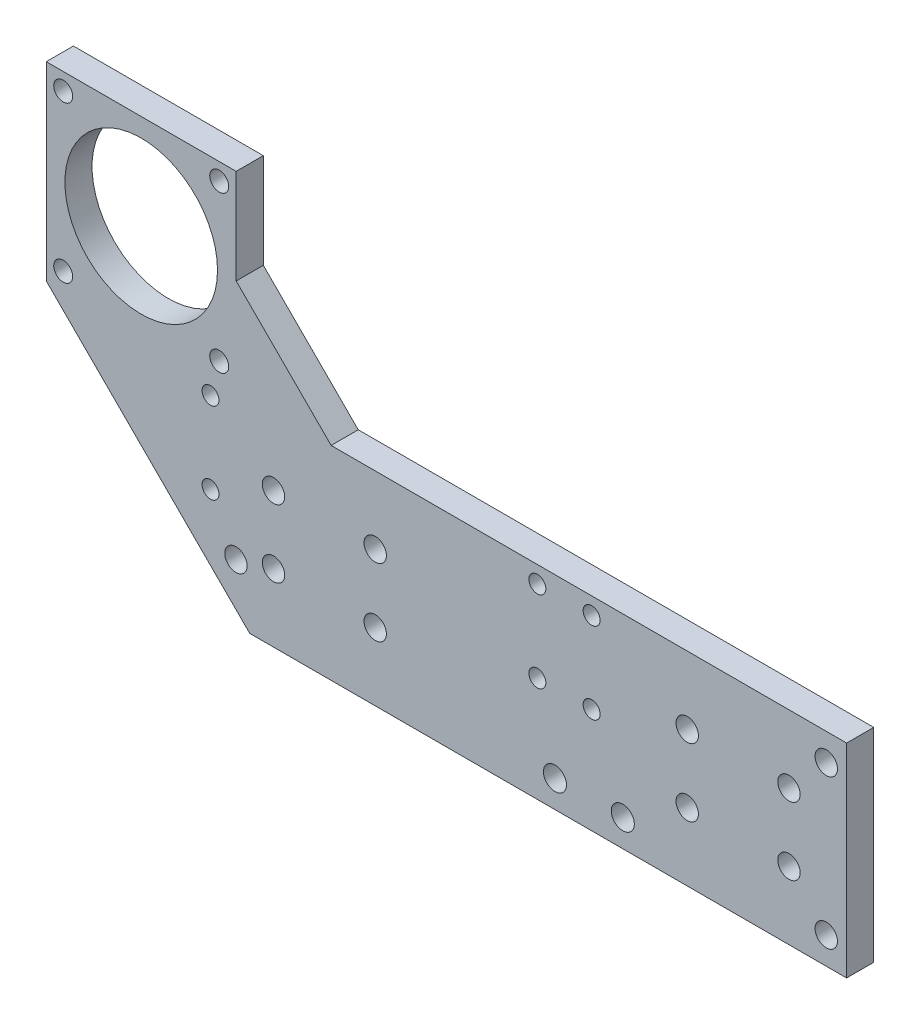
ISO-10303-21;
HEADER;
FILE_DESCRIPTION(('STEP AP214'),'2;1');
FILE_NAME('part.step','',(''),(''),'','','');
FILE_SCHEMA(('AUTOMOTIVE_DESIGN { 1 0 10303 214 1 1 1 1 }'));
ENDSEC;
DATA;
#1=APPLICATION_CONTEXT('core data for automotive mechanical design processes');
#2=APPLICATION_PROTOCOL_DEFINITION('international standard','automotive_design',2000,#1);
#3=PRODUCT_CONTEXT('',#1,'mechanical');
#4=PRODUCT('Part','Part','',(#3));
#5=PRODUCT_RELATED_PRODUCT_CATEGORY('part','',(#4));
#6=PRODUCT_DEFINITION_FORMATION('','',#4);
#7=PRODUCT_DEFINITION_CONTEXT('part definition',#1,'design');
#8=PRODUCT_DEFINITION('design','',#6,#7);
#9=PRODUCT_DEFINITION_SHAPE('','',#8);
#10=(LENGTH_UNIT() NAMED_UNIT(*) SI_UNIT(.MILLI.,.METRE.));
#11=(NAMED_UNIT(*) PLANE_ANGLE_UNIT() SI_UNIT($,.RADIAN.));
#12=(NAMED_UNIT(*) SI_UNIT($,.STERADIAN.) SOLID_ANGLE_UNIT());
#13=UNCERTAINTY_MEASURE_WITH_UNIT(LENGTH_MEASURE(1.E-05),#10,'distance_accuracy_value','');
#14=(GEOMETRIC_REPRESENTATION_CONTEXT(3) GLOBAL_UNCERTAINTY_ASSIGNED_CONTEXT((#13)) GLOBAL_UNIT_ASSIGNED_CONTEXT((#10,
#11,#12)) REPRESENTATION_CONTEXT('',''));
#15=CARTESIAN_POINT('',(0.,0.,0.));
#16=DIRECTION('',(0.,0.,1.));
#17=DIRECTION('',(1.,0.,0.));
#18=AXIS2_PLACEMENT_3D('',#15,#16,#17);
#19=CARTESIAN_POINT('',(-56.,29.,4.));
#20=DIRECTION('',(0.,-1.,0.));
#21=DIRECTION('',(0.,0.,-1.));
#22=AXIS2_PLACEMENT_3D('',#19,#20,#21);
#23=PLANE('',#22);
#24=DIRECTION('',(0.,0.,1.));
#25=VECTOR('',#24,1.);
#26=CARTESIAN_POINT('',(-27.999999999998,29.,0.));
#27=LINE('',#26,#25);
#28=CARTESIAN_POINT('',(-27.999999999998,29.,0.));
#29=VERTEX_POINT('',#28);
#30=CARTESIAN_POINT('',(-27.999999999998,29.,4.));
#31=VERTEX_POINT('',#30);
#32=EDGE_CURVE('E263',#29,#31,#27,.T.);
#33=ORIENTED_EDGE('',*,*,#32,.F.);
#34=DIRECTION('',(-1.,0.,0.));
#35=VECTOR('',#34,1.);
#36=CARTESIAN_POINT('',(-56.,29.,0.));
#37=LINE('',#36,#35);
#38=CARTESIAN_POINT('',(-56.,29.,0.));
#39=VERTEX_POINT('',#38);
#40=EDGE_CURVE('E261',#29,#39,#37,.T.);
#41=ORIENTED_EDGE('',*,*,#40,.T.);
#42=DIRECTION('',(0.,0.,-1.));
#43=VECTOR('',#42,1.);
#44=CARTESIAN_POINT('',(-56.,29.,4.));
#45=LINE('',#44,#43);
#46=CARTESIAN_POINT('',(-56.,29.,4.));
#47=VERTEX_POINT('',#46);
#48=EDGE_CURVE('E12',#47,#39,#45,.T.);
#49=ORIENTED_EDGE('',*,*,#48,.F.);
#50=DIRECTION('',(-1.,0.,0.));
#51=VECTOR('',#50,1.);
#52=CARTESIAN_POINT('',(-56.,29.,4.));
#53=LINE('',#52,#51);
#54=EDGE_CURVE('E67',#31,#47,#53,.T.);
#55=ORIENTED_EDGE('',*,*,#54,.F.);
#56=EDGE_LOOP('',(#33,#41,#49,#55));
#57=FACE_BOUND('',#56,.T.);
#58=ADVANCED_FACE('F44',(#57),#23,.F.);
#59=CARTESIAN_POINT('',(-56.,-29.,4.));
#60=DIRECTION('',(1.,0.,0.));
#61=DIRECTION('',(0.,0.,-1.));
#62=AXIS2_PLACEMENT_3D('',#59,#60,#61);
#63=PLANE('',#62);
#64=DIRECTION('',(0.,0.,1.));
#65=VECTOR('',#64,1.);
#66=CARTESIAN_POINT('',(-56.,0.999999999999984,0.));
#67=LINE('',#66,#65);
#68=CARTESIAN_POINT('',(-56.,0.999999999999977,0.));
#69=VERTEX_POINT('',#68);
#70=CARTESIAN_POINT('',(-56.,0.999999999999984,4.));
#71=VERTEX_POINT('',#70);
#72=EDGE_CURVE('E58',#69,#71,#67,.T.);
#73=ORIENTED_EDGE('',*,*,#72,.T.);
#74=DIRECTION('',(0.,-1.,0.));
#75=VECTOR('',#74,1.);
#76=CARTESIAN_POINT('',(-56.,-29.,4.));
#77=LINE('',#76,#75);
#78=EDGE_CURVE('E269',#47,#71,#77,.T.);
#79=ORIENTED_EDGE('',*,*,#78,.F.);
#80=ORIENTED_EDGE('',*,*,#48,.T.);
#81=DIRECTION('',(0.,-1.,0.));
#82=VECTOR('',#81,1.);
#83=CARTESIAN_POINT('',(-56.,-29.,0.));
#84=LINE('',#83,#82);
#85=EDGE_CURVE('E274',#39,#69,#84,.T.);
#86=ORIENTED_EDGE('',*,*,#85,.T.);
#87=EDGE_LOOP('',(#73,#79,#80,#86));
#88=FACE_BOUND('',#87,.T.);
#89=ADVANCED_FACE('F294',(#88),#63,.F.);
#90=CARTESIAN_POINT('',(-56.,-29.,4.));
#91=DIRECTION('',(0.,1.,0.));
#92=DIRECTION('',(0.,0.,1.));
#93=AXIS2_PLACEMENT_3D('',#90,#91,#92);
#94=PLANE('',#93);
#95=DIRECTION('',(0.,0.,1.));
#96=VECTOR('',#95,1.);
#97=CARTESIAN_POINT('',(-25.9999999999999,-29.,0.));
#98=LINE('',#97,#96);
#99=CARTESIAN_POINT('',(-25.9999999999999,-29.,0.));
#100=VERTEX_POINT('',#99);
#101=CARTESIAN_POINT('',(-25.9999999999999,-29.,4.));
#102=VERTEX_POINT('',#101);
#103=EDGE_CURVE('E259',#100,#102,#98,.T.);
#104=ORIENTED_EDGE('',*,*,#103,.F.);
#105=DIRECTION('',(1.,0.,0.));
#106=VECTOR('',#105,1.);
#107=CARTESIAN_POINT('',(-56.,-29.,0.));
#108=LINE('',#107,#106);
#109=CARTESIAN_POINT('',(62.,-29.,0.));
#110=VERTEX_POINT('',#109);
#111=EDGE_CURVE('E270',#100,#110,#108,.T.);
#112=ORIENTED_EDGE('',*,*,#111,.T.);
#113=DIRECTION('',(0.,0.,-1.));
#114=VECTOR('',#113,1.);
#115=CARTESIAN_POINT('',(62.,-29.,4.));
#116=LINE('',#115,#114);
#117=CARTESIAN_POINT('',(62.,-29.,4.));
#118=VERTEX_POINT('',#117);
#119=EDGE_CURVE('E130',#118,#110,#116,.T.);
#120=ORIENTED_EDGE('',*,*,#119,.F.);
#121=DIRECTION('',(1.,0.,0.));
#122=VECTOR('',#121,1.);
#123=CARTESIAN_POINT('',(-56.,-29.,4.));
#124=LINE('',#123,#122);
#125=EDGE_CURVE('E51',#102,#118,#124,.T.);
#126=ORIENTED_EDGE('',*,*,#125,.F.);
#127=EDGE_LOOP('',(#104,#112,#120,#126));
#128=FACE_BOUND('',#127,.T.);
#129=ADVANCED_FACE('F279',(#128),#94,.F.);
#130=CARTESIAN_POINT('',(0.,0.,4.));
#131=DIRECTION('',(0.,0.,-1.));
#132=DIRECTION('',(-1.,0.,0.));
#133=AXIS2_PLACEMENT_3D('',#130,#131,#132);
#134=PLANE('',#133);
#135=CARTESIAN_POINT('',(-30.499999999998,26.4999999999991,4.));
#136=DIRECTION('',(0.,0.,-1.));
#137=DIRECTION('',(-1.,0.,0.));
#138=AXIS2_PLACEMENT_3D('',#135,#136,#137);
#139=CIRCLE('',#138,1.4);
#140=CARTESIAN_POINT('',(-31.899999999998,26.4999999999991,4.));
#141=VERTEX_POINT('',#140);
#142=EDGE_CURVE('E619',#141,#141,#139,.T.);
#143=ORIENTED_EDGE('',*,*,#142,.T.);
#144=EDGE_LOOP('',(#143));
#145=FACE_BOUND('',#144,.T.);
#146=CARTESIAN_POINT('',(-30.499999999998,3.49999999999907,4.));
#147=DIRECTION('',(0.,0.,-1.));
#148=DIRECTION('',(-1.,0.,0.));
#149=AXIS2_PLACEMENT_3D('',#146,#147,#148);
#150=CIRCLE('',#149,1.4);
#151=CARTESIAN_POINT('',(-31.899999999998,3.49999999999907,4.));
#152=VERTEX_POINT('',#151);
#153=EDGE_CURVE('E623',#152,#152,#150,.T.);
#154=ORIENTED_EDGE('',*,*,#153,.T.);
#155=EDGE_LOOP('',(#154));
#156=FACE_BOUND('',#155,.T.);
#157=CARTESIAN_POINT('',(-53.499999999998,3.49999999999907,4.));
#158=DIRECTION('',(0.,0.,-1.));
#159=DIRECTION('',(-1.,0.,0.));
#160=AXIS2_PLACEMENT_3D('',#157,#158,#159);
#161=CIRCLE('',#160,1.4);
#162=CARTESIAN_POINT('',(-54.899999999998,3.49999999999907,4.));
#163=VERTEX_POINT('',#162);
#164=EDGE_CURVE('E754',#163,#163,#161,.T.);
#165=ORIENTED_EDGE('',*,*,#164,.T.);
#166=EDGE_LOOP('',(#165));
#167=FACE_BOUND('',#166,.T.);
#168=CARTESIAN_POINT('',(-53.499999999998,26.4999999999991,4.));
#169=DIRECTION('',(0.,0.,-1.));
#170=DIRECTION('',(-1.,0.,0.));
#171=AXIS2_PLACEMENT_3D('',#168,#169,#170);
#172=CIRCLE('',#171,1.4);
#173=CARTESIAN_POINT('',(-54.899999999998,26.4999999999991,4.));
#174=VERTEX_POINT('',#173);
#175=EDGE_CURVE('E631',#174,#174,#172,.T.);
#176=ORIENTED_EDGE('',*,*,#175,.T.);
#177=EDGE_LOOP('',(#176));
#178=FACE_BOUND('',#177,.T.);
#179=CARTESIAN_POINT('',(-28.0365899109323,-20.5936707070235,4.));
#180=DIRECTION('',(0.,0.,1.));
#181=DIRECTION('',(1.,0.,0.));
#182=AXIS2_PLACEMENT_3D('',#179,#180,#181);
#183=CIRCLE('',#182,1.65);
#184=CARTESIAN_POINT('',(-26.3865899109323,-20.5936707070235,4.));
#185=VERTEX_POINT('',#184);
#186=EDGE_CURVE('E639',#185,#185,#183,.T.);
#187=ORIENTED_EDGE('',*,*,#186,.F.);
#188=EDGE_LOOP('',(#187));
#189=FACE_BOUND('',#188,.T.);
#190=CARTESIAN_POINT('',(59.,-25.,4.));
#191=DIRECTION('',(0.,0.,1.));
#192=DIRECTION('',(1.,0.,0.));
#193=AXIS2_PLACEMENT_3D('',#190,#191,#192);
#194=CIRCLE('',#193,1.65);
#195=CARTESIAN_POINT('',(60.65,-25.,4.));
#196=VERTEX_POINT('',#195);
#197=EDGE_CURVE('E137',#196,#196,#194,.T.);
#198=ORIENTED_EDGE('',*,*,#197,.F.);
#199=EDGE_LOOP('',(#198));
#200=FACE_BOUND('',#199,.T.);
#201=CARTESIAN_POINT('',(59.,-3.00000000000009,4.));
#202=DIRECTION('',(0.,0.,1.));
#203=DIRECTION('',(1.,0.,0.));
#204=AXIS2_PLACEMENT_3D('',#201,#202,#203);
#205=CIRCLE('',#204,1.65);
#206=CARTESIAN_POINT('',(60.65,-3.00000000000009,4.));
#207=VERTEX_POINT('',#206);
#208=EDGE_CURVE('E140',#207,#207,#205,.T.);
#209=ORIENTED_EDGE('',*,*,#208,.F.);
#210=EDGE_LOOP('',(#209));
#211=FACE_BOUND('',#210,.T.);
#212=CARTESIAN_POINT('',(-31.7799468470379,-13.5000000000001,4.));
#213=DIRECTION('',(0.,0.,-1.));
#214=DIRECTION('',(-1.,0.,0.));
#215=AXIS2_PLACEMENT_3D('',#212,#213,#214);
#216=CIRCLE('',#215,1.25);
#217=CARTESIAN_POINT('',(-33.0299468470379,-13.5000000000001,4.));
#218=VERTEX_POINT('',#217);
#219=EDGE_CURVE('E150',#218,#218,#216,.F.);
#220=ORIENTED_EDGE('',*,*,#219,.F.);
#221=EDGE_LOOP('',(#220));
#222=FACE_BOUND('',#221,.T.);
#223=CARTESIAN_POINT('',(24.4060078963208,-1.5000000000002,4.));
#224=DIRECTION('',(0.,0.,-1.));
#225=DIRECTION('',(-1.,0.,0.));
#226=AXIS2_PLACEMENT_3D('',#223,#224,#225);
#227=CIRCLE('',#226,1.25);
#228=CARTESIAN_POINT('',(23.1560078963208,-1.5000000000002,4.));
#229=VERTEX_POINT('',#228);
#230=EDGE_CURVE('E151',#229,#229,#227,.F.);
#231=ORIENTED_EDGE('',*,*,#230,.F.);
#232=EDGE_LOOP('',(#231));
#233=FACE_BOUND('',#232,.T.);
#234=CARTESIAN_POINT('',(16.4060078963208,-1.5000000000002,4.));
#235=DIRECTION('',(0.,0.,-1.));
#236=DIRECTION('',(-1.,0.,0.));
#237=AXIS2_PLACEMENT_3D('',#234,#235,#236);
#238=CIRCLE('',#237,1.25);
#239=CARTESIAN_POINT('',(15.1560078963208,-1.5000000000002,4.));
#240=VERTEX_POINT('',#239);
#241=EDGE_CURVE('E158',#240,#240,#238,.F.);
#242=ORIENTED_EDGE('',*,*,#241,.F.);
#243=EDGE_LOOP('',(#242));
#244=FACE_BOUND('',#243,.T.);
#245=CARTESIAN_POINT('',(24.4060078963208,-13.5000000000002,4.));
#246=DIRECTION('',(0.,0.,-1.));
#247=DIRECTION('',(-1.,0.,0.));
#248=AXIS2_PLACEMENT_3D('',#245,#246,#247);
#249=CIRCLE('',#248,1.25);
#250=CARTESIAN_POINT('',(23.1560078963208,-13.5000000000002,4.));
#251=VERTEX_POINT('',#250);
#252=EDGE_CURVE('E163',#251,#251,#249,.F.);
#253=ORIENTED_EDGE('',*,*,#252,.F.);
#254=EDGE_LOOP('',(#253));
#255=FACE_BOUND('',#254,.T.);
#256=CARTESIAN_POINT('',(-31.7799468470379,-1.5000000000001,4.));
#257=DIRECTION('',(0.,0.,-1.));
#258=DIRECTION('',(-1.,0.,0.));
#259=AXIS2_PLACEMENT_3D('',#256,#257,#258);
#260=CIRCLE('',#259,1.25);
#261=CARTESIAN_POINT('',(-33.0299468470379,-1.5000000000001,4.));
#262=VERTEX_POINT('',#261);
#263=EDGE_CURVE('E143',#262,#262,#260,.F.);
#264=ORIENTED_EDGE('',*,*,#263,.F.);
#265=EDGE_LOOP('',(#264));
#266=FACE_BOUND('',#265,.T.);
#267=CARTESIAN_POINT('',(16.4060078963208,-13.5000000000002,4.));
#268=DIRECTION('',(0.,0.,-1.));
#269=DIRECTION('',(-1.,0.,0.));
#270=AXIS2_PLACEMENT_3D('',#267,#268,#269);
#271=CIRCLE('',#270,1.25);
#272=CARTESIAN_POINT('',(15.1560078963208,-13.5000000000002,4.));
#273=VERTEX_POINT('',#272);
#274=EDGE_CURVE('E177',#273,#273,#271,.F.);
#275=ORIENTED_EDGE('',*,*,#274,.F.);
#276=EDGE_LOOP('',(#275));
#277=FACE_BOUND('',#276,.T.);
#278=CARTESIAN_POINT('',(38.5,-9.00000000000003,4.));
#279=DIRECTION('',(0.,0.,1.));
#280=DIRECTION('',(1.,0.,0.));
#281=AXIS2_PLACEMENT_3D('',#278,#279,#280);
#282=CIRCLE('',#281,1.65);
#283=CARTESIAN_POINT('',(40.15,-9.00000000000003,4.));
#284=VERTEX_POINT('',#283);
#285=EDGE_CURVE('E203',#284,#284,#282,.T.);
#286=ORIENTED_EDGE('',*,*,#285,.F.);
#287=EDGE_LOOP('',(#286));
#288=FACE_BOUND('',#287,.T.);
#289=CARTESIAN_POINT('',(53.5,-19.,4.));
#290=DIRECTION('',(0.,0.,1.));
#291=DIRECTION('',(1.,0.,0.));
#292=AXIS2_PLACEMENT_3D('',#289,#290,#291);
#293=CIRCLE('',#292,1.65);
#294=CARTESIAN_POINT('',(55.15,-19.,4.));
#295=VERTEX_POINT('',#294);
#296=EDGE_CURVE('E190',#295,#295,#293,.T.);
#297=ORIENTED_EDGE('',*,*,#296,.F.);
#298=EDGE_LOOP('',(#297));
#299=FACE_BOUND('',#298,.T.);
#300=CARTESIAN_POINT('',(53.5,-9.00000000000002,4.));
#301=DIRECTION('',(0.,0.,1.));
#302=DIRECTION('',(1.,0.,0.));
#303=AXIS2_PLACEMENT_3D('',#300,#301,#302);
#304=CIRCLE('',#303,1.65);
#305=CARTESIAN_POINT('',(55.15,-9.00000000000002,4.));
#306=VERTEX_POINT('',#305);
#307=EDGE_CURVE('E191',#306,#306,#304,.T.);
#308=ORIENTED_EDGE('',*,*,#307,.F.);
#309=EDGE_LOOP('',(#308));
#310=FACE_BOUND('',#309,.T.);
#311=CARTESIAN_POINT('',(19.0000000000001,-25.,4.));
#312=DIRECTION('',(0.,0.,1.));
#313=DIRECTION('',(1.,0.,0.));
#314=AXIS2_PLACEMENT_3D('',#311,#312,#313);
#315=CIRCLE('',#314,1.7);
#316=CARTESIAN_POINT('',(20.7000000000001,-25.,4.));
#317=VERTEX_POINT('',#316);
#318=EDGE_CURVE('E184',#317,#317,#315,.T.);
#319=ORIENTED_EDGE('',*,*,#318,.F.);
#320=EDGE_LOOP('',(#319));
#321=FACE_BOUND('',#320,.T.);
#322=CARTESIAN_POINT('',(-22.5,-9.00000000000002,4.));
#323=DIRECTION('',(0.,0.,1.));
#324=DIRECTION('',(1.,0.,0.));
#325=AXIS2_PLACEMENT_3D('',#322,#323,#324);
#326=CIRCLE('',#325,1.65);
#327=CARTESIAN_POINT('',(-20.85,-9.00000000000002,4.));
#328=VERTEX_POINT('',#327);
#329=EDGE_CURVE('E227',#328,#328,#326,.T.);
#330=ORIENTED_EDGE('',*,*,#329,.F.);
#331=EDGE_LOOP('',(#330));
#332=FACE_BOUND('',#331,.T.);
#333=CARTESIAN_POINT('',(-7.5,-19.,4.));
#334=DIRECTION('',(0.,0.,1.));
#335=DIRECTION('',(1.,0.,0.));
#336=AXIS2_PLACEMENT_3D('',#333,#334,#335);
#337=CIRCLE('',#336,1.65);
#338=CARTESIAN_POINT('',(-5.85,-19.,4.));
#339=VERTEX_POINT('',#338);
#340=EDGE_CURVE('E214',#339,#339,#337,.T.);
#341=ORIENTED_EDGE('',*,*,#340,.F.);
#342=EDGE_LOOP('',(#341));
#343=FACE_BOUND('',#342,.T.);
#344=CARTESIAN_POINT('',(-7.5,-9.00000000000003,4.));
#345=DIRECTION('',(0.,0.,1.));
#346=DIRECTION('',(1.,0.,0.));
#347=AXIS2_PLACEMENT_3D('',#344,#345,#346);
#348=CIRCLE('',#347,1.65);
#349=CARTESIAN_POINT('',(-5.85,-9.00000000000003,4.));
#350=VERTEX_POINT('',#349);
#351=EDGE_CURVE('E215',#350,#350,#348,.T.);
#352=ORIENTED_EDGE('',*,*,#351,.F.);
#353=EDGE_LOOP('',(#352));
#354=FACE_BOUND('',#353,.T.);
#355=CARTESIAN_POINT('',(38.5,-19.,4.));
#356=DIRECTION('',(0.,0.,1.));
#357=DIRECTION('',(1.,0.,0.));
#358=AXIS2_PLACEMENT_3D('',#355,#356,#357);
#359=CIRCLE('',#358,1.65);
#360=CARTESIAN_POINT('',(40.15,-19.,4.));
#361=VERTEX_POINT('',#360);
#362=EDGE_CURVE('E202',#361,#361,#359,.T.);
#363=ORIENTED_EDGE('',*,*,#362,.F.);
#364=EDGE_LOOP('',(#363));
#365=FACE_BOUND('',#364,.T.);
#366=CARTESIAN_POINT('',(29.0000000000001,-25.,4.));
#367=DIRECTION('',(0.,0.,1.));
#368=DIRECTION('',(1.,0.,0.));
#369=AXIS2_PLACEMENT_3D('',#366,#367,#368);
#370=CIRCLE('',#369,1.7);
#371=CARTESIAN_POINT('',(30.7000000000001,-25.,4.));
#372=VERTEX_POINT('',#371);
#373=EDGE_CURVE('E180',#372,#372,#370,.T.);
#374=ORIENTED_EDGE('',*,*,#373,.F.);
#375=EDGE_LOOP('',(#374));
#376=FACE_BOUND('',#375,.T.);
#377=CARTESIAN_POINT('',(-22.5,-19.,4.));
#378=DIRECTION('',(0.,0.,1.));
#379=DIRECTION('',(1.,0.,0.));
#380=AXIS2_PLACEMENT_3D('',#377,#378,#379);
#381=CIRCLE('',#380,1.65);
#382=CARTESIAN_POINT('',(-20.85,-19.,4.));
#383=VERTEX_POINT('',#382);
#384=EDGE_CURVE('E235',#383,#383,#381,.T.);
#385=ORIENTED_EDGE('',*,*,#384,.F.);
#386=EDGE_LOOP('',(#385));
#387=FACE_BOUND('',#386,.T.);
#388=CARTESIAN_POINT('',(-41.999999999998,14.9999999999991,4.));
#389=DIRECTION('',(0.,0.,1.));
#390=DIRECTION('',(1.,0.,0.));
#391=AXIS2_PLACEMENT_3D('',#388,#389,#390);
#392=CIRCLE('',#391,11.25);
#393=CARTESIAN_POINT('',(-30.749999999998,14.9999999999991,4.));
#394=VERTEX_POINT('',#393);
#395=EDGE_CURVE('E238',#394,#394,#392,.T.);
#396=ORIENTED_EDGE('',*,*,#395,.F.);
#397=EDGE_LOOP('',(#396));
#398=FACE_BOUND('',#397,.T.);
#399=DIRECTION('',(0.707106781186549,-0.707106781186546,0.));
#400=VECTOR('',#399,1.);
#401=CARTESIAN_POINT('',(-56.,0.999999999999984,4.));
#402=LINE('',#401,#400);
#403=EDGE_CURVE('E248',#71,#102,#402,.T.);
#404=ORIENTED_EDGE('',*,*,#403,.T.);
#405=ORIENTED_EDGE('',*,*,#125,.T.);
#406=DIRECTION('',(0.,-1.,0.));
#407=VECTOR('',#406,1.);
#408=CARTESIAN_POINT('',(62.,0.999999999999907,4.));
#409=LINE('',#408,#407);
#410=CARTESIAN_POINT('',(62.,0.999999999999907,4.));
#411=VERTEX_POINT('',#410);
#412=EDGE_CURVE('E127',#411,#118,#409,.T.);
#413=ORIENTED_EDGE('',*,*,#412,.F.);
#414=DIRECTION('',(-1.,0.,0.));
#415=VECTOR('',#414,1.);
#416=CARTESIAN_POINT('',(56.,0.999999999999914,4.));
#417=LINE('',#416,#415);
#418=CARTESIAN_POINT('',(-13.9999999999988,0.999999999999914,4.));
#419=VERTEX_POINT('',#418);
#420=EDGE_CURVE('E110',#411,#419,#417,.T.);
#421=ORIENTED_EDGE('',*,*,#420,.T.);
#422=DIRECTION('',(-0.707106781186548,0.707106781186547,0.));
#423=VECTOR('',#422,1.);
#424=CARTESIAN_POINT('',(-13.9999999999988,0.999999999999914,4.));
#425=LINE('',#424,#423);
#426=CARTESIAN_POINT('',(-27.999999999998,14.9999999999991,4.));
#427=VERTEX_POINT('',#426);
#428=EDGE_CURVE('E120',#419,#427,#425,.T.);
#429=ORIENTED_EDGE('',*,*,#428,.T.);
#430=DIRECTION('',(0.,1.,0.));
#431=VECTOR('',#430,1.);
#432=CARTESIAN_POINT('',(-27.999999999998,29.,4.));
#433=LINE('',#432,#431);
#434=EDGE_CURVE('E256',#427,#31,#433,.T.);
#435=ORIENTED_EDGE('',*,*,#434,.T.);
#436=ORIENTED_EDGE('',*,*,#54,.T.);
#437=ORIENTED_EDGE('',*,*,#78,.T.);
#438=EDGE_LOOP('',(#404,#405,#413,#421,#429,#435,#436,#437));
#439=FACE_BOUND('',#438,.T.);
#440=ADVANCED_FACE('F133',(#145,#156,#167,#178,#189,#200,#211,#222,#233,#244,#255,#266,#277,
#288,#299,#310,#321,#332,#343,#354,#365,#376,#387,#398,#439),#134,.F.);
#441=CARTESIAN_POINT('',(0.,0.,0.));
#442=DIRECTION('',(0.,0.,-1.));
#443=DIRECTION('',(-1.,0.,0.));
#444=AXIS2_PLACEMENT_3D('',#441,#442,#443);
#445=PLANE('',#444);
#446=CARTESIAN_POINT('',(-30.499999999998,26.4999999999991,0.));
#447=DIRECTION('',(0.,0.,-1.));
#448=DIRECTION('',(-1.,0.,0.));
#449=AXIS2_PLACEMENT_3D('',#446,#447,#448);
#450=CIRCLE('',#449,1.4);
#451=CARTESIAN_POINT('',(-31.899999999998,26.4999999999991,0.));
#452=VERTEX_POINT('',#451);
#453=EDGE_CURVE('E622',#452,#452,#450,.T.);
#454=ORIENTED_EDGE('',*,*,#453,.F.);
#455=EDGE_LOOP('',(#454));
#456=FACE_BOUND('',#455,.T.);
#457=CARTESIAN_POINT('',(-30.499999999998,3.49999999999907,0.));
#458=DIRECTION('',(0.,0.,-1.));
#459=DIRECTION('',(-1.,0.,0.));
#460=AXIS2_PLACEMENT_3D('',#457,#458,#459);
#461=CIRCLE('',#460,1.4);
#462=CARTESIAN_POINT('',(-31.899999999998,3.49999999999907,0.));
#463=VERTEX_POINT('',#462);
#464=EDGE_CURVE('E626',#463,#463,#461,.T.);
#465=ORIENTED_EDGE('',*,*,#464,.F.);
#466=EDGE_LOOP('',(#465));
#467=FACE_BOUND('',#466,.T.);
#468=CARTESIAN_POINT('',(-53.499999999998,3.49999999999907,0.));
#469=DIRECTION('',(0.,0.,-1.));
#470=DIRECTION('',(-1.,0.,0.));
#471=AXIS2_PLACEMENT_3D('',#468,#469,#470);
#472=CIRCLE('',#471,1.4);
#473=CARTESIAN_POINT('',(-54.899999999998,3.49999999999907,0.));
#474=VERTEX_POINT('',#473);
#475=EDGE_CURVE('E638',#474,#474,#472,.T.);
#476=ORIENTED_EDGE('',*,*,#475,.F.);
#477=EDGE_LOOP('',(#476));
#478=FACE_BOUND('',#477,.T.);
#479=CARTESIAN_POINT('',(-53.499999999998,26.4999999999991,0.));
#480=DIRECTION('',(0.,0.,-1.));
#481=DIRECTION('',(-1.,0.,0.));
#482=AXIS2_PLACEMENT_3D('',#479,#480,#481);
#483=CIRCLE('',#482,1.4);
#484=CARTESIAN_POINT('',(-54.899999999998,26.4999999999991,0.));
#485=VERTEX_POINT('',#484);
#486=EDGE_CURVE('E635',#485,#485,#483,.T.);
#487=ORIENTED_EDGE('',*,*,#486,.F.);
#488=EDGE_LOOP('',(#487));
#489=FACE_BOUND('',#488,.T.);
#490=CARTESIAN_POINT('',(-28.0365899109323,-20.5936707070235,0.));
#491=DIRECTION('',(0.,0.,-1.));
#492=DIRECTION('',(-1.,0.,0.));
#493=AXIS2_PLACEMENT_3D('',#490,#491,#492);
#494=CIRCLE('',#493,1.65);
#495=CARTESIAN_POINT('',(-29.6865899109323,-20.5936707070235,0.));
#496=VERTEX_POINT('',#495);
#497=EDGE_CURVE('E634',#496,#496,#494,.F.);
#498=ORIENTED_EDGE('',*,*,#497,.T.);
#499=EDGE_LOOP('',(#498));
#500=FACE_BOUND('',#499,.T.);
#501=CARTESIAN_POINT('',(59.,-25.,0.));
#502=DIRECTION('',(0.,0.,-1.));
#503=DIRECTION('',(-1.,0.,0.));
#504=AXIS2_PLACEMENT_3D('',#501,#502,#503);
#505=CIRCLE('',#504,1.65);
#506=CARTESIAN_POINT('',(57.35,-25.,0.));
#507=VERTEX_POINT('',#506);
#508=EDGE_CURVE('E646',#507,#507,#505,.F.);
#509=ORIENTED_EDGE('',*,*,#508,.T.);
#510=EDGE_LOOP('',(#509));
#511=FACE_BOUND('',#510,.T.);
#512=CARTESIAN_POINT('',(59.,-3.00000000000009,0.));
#513=DIRECTION('',(0.,0.,-1.));
#514=DIRECTION('',(-1.,0.,0.));
#515=AXIS2_PLACEMENT_3D('',#512,#513,#514);
#516=CIRCLE('',#515,1.65);
#517=CARTESIAN_POINT('',(57.35,-3.00000000000009,0.));
#518=VERTEX_POINT('',#517);
#519=EDGE_CURVE('E648',#518,#518,#516,.F.);
#520=ORIENTED_EDGE('',*,*,#519,.T.);
#521=EDGE_LOOP('',(#520));
#522=FACE_BOUND('',#521,.T.);
#523=CARTESIAN_POINT('',(-31.7799468470379,-13.5000000000001,0.));
#524=DIRECTION('',(0.,0.,-1.));
#525=DIRECTION('',(-1.,0.,0.));
#526=AXIS2_PLACEMENT_3D('',#523,#524,#525);
#527=CIRCLE('',#526,1.25);
#528=CARTESIAN_POINT('',(-33.0299468470379,-13.5000000000001,0.));
#529=VERTEX_POINT('',#528);
#530=EDGE_CURVE('E155',#529,#529,#527,.T.);
#531=ORIENTED_EDGE('',*,*,#530,.F.);
#532=EDGE_LOOP('',(#531));
#533=FACE_BOUND('',#532,.T.);
#534=CARTESIAN_POINT('',(24.4060078963208,-1.5000000000002,0.));
#535=DIRECTION('',(0.,0.,-1.));
#536=DIRECTION('',(-1.,0.,0.));
#537=AXIS2_PLACEMENT_3D('',#534,#535,#536);
#538=CIRCLE('',#537,1.25);
#539=CARTESIAN_POINT('',(23.1560078963208,-1.5000000000002,0.));
#540=VERTEX_POINT('',#539);
#541=EDGE_CURVE('E154',#540,#540,#538,.T.);
#542=ORIENTED_EDGE('',*,*,#541,.F.);
#543=EDGE_LOOP('',(#542));
#544=FACE_BOUND('',#543,.T.);
#545=CARTESIAN_POINT('',(16.4060078963208,-1.5000000000002,0.));
#546=DIRECTION('',(0.,0.,-1.));
#547=DIRECTION('',(-1.,0.,0.));
#548=AXIS2_PLACEMENT_3D('',#545,#546,#547);
#549=CIRCLE('',#548,1.25);
#550=CARTESIAN_POINT('',(15.1560078963208,-1.5000000000002,0.));
#551=VERTEX_POINT('',#550);
#552=EDGE_CURVE('E167',#551,#551,#549,.T.);
#553=ORIENTED_EDGE('',*,*,#552,.F.);
#554=EDGE_LOOP('',(#553));
#555=FACE_BOUND('',#554,.T.);
#556=CARTESIAN_POINT('',(24.4060078963208,-13.5000000000002,0.));
#557=DIRECTION('',(0.,0.,-1.));
#558=DIRECTION('',(-1.,0.,0.));
#559=AXIS2_PLACEMENT_3D('',#556,#557,#558);
#560=CIRCLE('',#559,1.25);
#561=CARTESIAN_POINT('',(23.1560078963208,-13.5000000000002,0.));
#562=VERTEX_POINT('',#561);
#563=EDGE_CURVE('E166',#562,#562,#560,.T.);
#564=ORIENTED_EDGE('',*,*,#563,.F.);
#565=EDGE_LOOP('',(#564));
#566=FACE_BOUND('',#565,.T.);
#567=CARTESIAN_POINT('',(-31.7799468470379,-1.5000000000001,0.));
#568=DIRECTION('',(0.,0.,-1.));
#569=DIRECTION('',(-1.,0.,0.));
#570=AXIS2_PLACEMENT_3D('',#567,#568,#569);
#571=CIRCLE('',#570,1.25);
#572=CARTESIAN_POINT('',(-33.0299468470379,-1.5000000000001,0.));
#573=VERTEX_POINT('',#572);
#574=EDGE_CURVE('E147',#573,#573,#571,.T.);
#575=ORIENTED_EDGE('',*,*,#574,.F.);
#576=EDGE_LOOP('',(#575));
#577=FACE_BOUND('',#576,.T.);
#578=CARTESIAN_POINT('',(16.4060078963208,-13.5000000000002,0.));
#579=DIRECTION('',(0.,0.,-1.));
#580=DIRECTION('',(-1.,0.,0.));
#581=AXIS2_PLACEMENT_3D('',#578,#579,#580);
#582=CIRCLE('',#581,1.25);
#583=CARTESIAN_POINT('',(15.1560078963208,-13.5000000000002,0.));
#584=VERTEX_POINT('',#583);
#585=EDGE_CURVE('E170',#584,#584,#582,.T.);
#586=ORIENTED_EDGE('',*,*,#585,.F.);
#587=EDGE_LOOP('',(#586));
#588=FACE_BOUND('',#587,.T.);
#589=CARTESIAN_POINT('',(38.5,-9.00000000000003,0.));
#590=DIRECTION('',(0.,0.,-1.));
#591=DIRECTION('',(-1.,0.,0.));
#592=AXIS2_PLACEMENT_3D('',#589,#590,#591);
#593=CIRCLE('',#592,1.65);
#594=CARTESIAN_POINT('',(36.85,-9.00000000000003,0.));
#595=VERTEX_POINT('',#594);
#596=EDGE_CURVE('E199',#595,#595,#593,.F.);
#597=ORIENTED_EDGE('',*,*,#596,.T.);
#598=EDGE_LOOP('',(#597));
#599=FACE_BOUND('',#598,.T.);
#600=CARTESIAN_POINT('',(53.5,-19.,0.));
#601=DIRECTION('',(0.,0.,-1.));
#602=DIRECTION('',(-1.,0.,0.));
#603=AXIS2_PLACEMENT_3D('',#600,#601,#602);
#604=CIRCLE('',#603,1.65);
#605=CARTESIAN_POINT('',(51.8500000000001,-19.,0.));
#606=VERTEX_POINT('',#605);
#607=EDGE_CURVE('E206',#606,#606,#604,.F.);
#608=ORIENTED_EDGE('',*,*,#607,.T.);
#609=EDGE_LOOP('',(#608));
#610=FACE_BOUND('',#609,.T.);
#611=CARTESIAN_POINT('',(53.5,-9.00000000000002,0.));
#612=DIRECTION('',(0.,0.,-1.));
#613=DIRECTION('',(-1.,0.,0.));
#614=AXIS2_PLACEMENT_3D('',#611,#612,#613);
#615=CIRCLE('',#614,1.65);
#616=CARTESIAN_POINT('',(51.85,-9.00000000000002,0.));
#617=VERTEX_POINT('',#616);
#618=EDGE_CURVE('E187',#617,#617,#615,.F.);
#619=ORIENTED_EDGE('',*,*,#618,.T.);
#620=EDGE_LOOP('',(#619));
#621=FACE_BOUND('',#620,.T.);
#622=CARTESIAN_POINT('',(19.0000000000001,-25.,0.));
#623=DIRECTION('',(0.,0.,-1.));
#624=DIRECTION('',(-1.,0.,0.));
#625=AXIS2_PLACEMENT_3D('',#622,#623,#624);
#626=CIRCLE('',#625,1.7);
#627=CARTESIAN_POINT('',(17.3000000000001,-25.,0.));
#628=VERTEX_POINT('',#627);
#629=EDGE_CURVE('E194',#628,#628,#626,.F.);
#630=ORIENTED_EDGE('',*,*,#629,.T.);
#631=EDGE_LOOP('',(#630));
#632=FACE_BOUND('',#631,.T.);
#633=CARTESIAN_POINT('',(-22.5,-9.00000000000002,0.));
#634=DIRECTION('',(0.,0.,-1.));
#635=DIRECTION('',(-1.,0.,0.));
#636=AXIS2_PLACEMENT_3D('',#633,#634,#635);
#637=CIRCLE('',#636,1.65);
#638=CARTESIAN_POINT('',(-24.15,-9.00000000000002,0.));
#639=VERTEX_POINT('',#638);
#640=EDGE_CURVE('E223',#639,#639,#637,.F.);
#641=ORIENTED_EDGE('',*,*,#640,.T.);
#642=EDGE_LOOP('',(#641));
#643=FACE_BOUND('',#642,.T.);
#644=CARTESIAN_POINT('',(-7.5,-19.,0.));
#645=DIRECTION('',(0.,0.,-1.));
#646=DIRECTION('',(-1.,0.,0.));
#647=AXIS2_PLACEMENT_3D('',#644,#645,#646);
#648=CIRCLE('',#647,1.65);
#649=CARTESIAN_POINT('',(-9.15,-19.,0.));
#650=VERTEX_POINT('',#649);
#651=EDGE_CURVE('E230',#650,#650,#648,.F.);
#652=ORIENTED_EDGE('',*,*,#651,.T.);
#653=EDGE_LOOP('',(#652));
#654=FACE_BOUND('',#653,.T.);
#655=CARTESIAN_POINT('',(-7.5,-9.00000000000003,0.));
#656=DIRECTION('',(0.,0.,-1.));
#657=DIRECTION('',(-1.,0.,0.));
#658=AXIS2_PLACEMENT_3D('',#655,#656,#657);
#659=CIRCLE('',#658,1.65);
#660=CARTESIAN_POINT('',(-9.15,-9.00000000000003,0.));
#661=VERTEX_POINT('',#660);
#662=EDGE_CURVE('E211',#661,#661,#659,.F.);
#663=ORIENTED_EDGE('',*,*,#662,.T.);
#664=EDGE_LOOP('',(#663));
#665=FACE_BOUND('',#664,.T.);
#666=CARTESIAN_POINT('',(38.5,-19.,0.));
#667=DIRECTION('',(0.,0.,-1.));
#668=DIRECTION('',(-1.,0.,0.));
#669=AXIS2_PLACEMENT_3D('',#666,#667,#668);
#670=CIRCLE('',#669,1.65);
#671=CARTESIAN_POINT('',(36.8500000000001,-19.,0.));
#672=VERTEX_POINT('',#671);
#673=EDGE_CURVE('E218',#672,#672,#670,.F.);
#674=ORIENTED_EDGE('',*,*,#673,.T.);
#675=EDGE_LOOP('',(#674));
#676=FACE_BOUND('',#675,.T.);
#677=CARTESIAN_POINT('',(29.0000000000001,-25.,0.));
#678=DIRECTION('',(0.,0.,-1.));
#679=DIRECTION('',(-1.,0.,0.));
#680=AXIS2_PLACEMENT_3D('',#677,#678,#679);
#681=CIRCLE('',#680,1.7);
#682=CARTESIAN_POINT('',(27.3000000000001,-25.,0.));
#683=VERTEX_POINT('',#682);
#684=EDGE_CURVE('E181',#683,#683,#681,.F.);
#685=ORIENTED_EDGE('',*,*,#684,.T.);
#686=EDGE_LOOP('',(#685));
#687=FACE_BOUND('',#686,.T.);
#688=CARTESIAN_POINT('',(-22.5,-19.,0.));
#689=DIRECTION('',(0.,0.,-1.));
#690=DIRECTION('',(-1.,0.,0.));
#691=AXIS2_PLACEMENT_3D('',#688,#689,#690);
#692=CIRCLE('',#691,1.65);
#693=CARTESIAN_POINT('',(-24.15,-19.,0.));
#694=VERTEX_POINT('',#693);
#695=EDGE_CURVE('E226',#694,#694,#692,.F.);
#696=ORIENTED_EDGE('',*,*,#695,.T.);
#697=EDGE_LOOP('',(#696));
#698=FACE_BOUND('',#697,.T.);
#699=CARTESIAN_POINT('',(-41.999999999998,14.9999999999991,0.));
#700=DIRECTION('',(0.,0.,1.));
#701=DIRECTION('',(1.,0.,0.));
#702=AXIS2_PLACEMENT_3D('',#699,#700,#701);
#703=CIRCLE('',#702,11.25);
#704=CARTESIAN_POINT('',(-30.749999999998,14.9999999999991,0.));
#705=VERTEX_POINT('',#704);
#706=EDGE_CURVE('E121',#705,#705,#703,.T.);
#707=ORIENTED_EDGE('',*,*,#706,.T.);
#708=EDGE_LOOP('',(#707));
#709=FACE_BOUND('',#708,.T.);
#710=ORIENTED_EDGE('',*,*,#111,.F.);
#711=DIRECTION('',(0.707106781186549,-0.707106781186546,0.));
#712=VECTOR('',#711,1.);
#713=CARTESIAN_POINT('',(-56.,0.999999999999984,0.));
#714=LINE('',#713,#712);
#715=EDGE_CURVE('E253',#69,#100,#714,.T.);
#716=ORIENTED_EDGE('',*,*,#715,.F.);
#717=ORIENTED_EDGE('',*,*,#85,.F.);
#718=ORIENTED_EDGE('',*,*,#40,.F.);
#719=DIRECTION('',(0.,1.,0.));
#720=VECTOR('',#719,1.);
#721=CARTESIAN_POINT('',(-27.999999999998,29.,0.));
#722=LINE('',#721,#720);
#723=CARTESIAN_POINT('',(-27.999999999998,14.9999999999991,0.));
#724=VERTEX_POINT('',#723);
#725=EDGE_CURVE('E251',#724,#29,#722,.T.);
#726=ORIENTED_EDGE('',*,*,#725,.F.);
#727=DIRECTION('',(-0.707106781186548,0.707106781186547,0.));
#728=VECTOR('',#727,1.);
#729=CARTESIAN_POINT('',(-13.9999999999988,0.999999999999914,0.));
#730=LINE('',#729,#728);
#731=CARTESIAN_POINT('',(-13.9999999999988,0.999999999999914,0.));
#732=VERTEX_POINT('',#731);
#733=EDGE_CURVE('E247',#732,#724,#730,.T.);
#734=ORIENTED_EDGE('',*,*,#733,.F.);
#735=DIRECTION('',(-1.,0.,0.));
#736=VECTOR('',#735,1.);
#737=CARTESIAN_POINT('',(56.,0.999999999999914,0.));
#738=LINE('',#737,#736);
#739=CARTESIAN_POINT('',(62.,0.999999999999907,0.));
#740=VERTEX_POINT('',#739);
#741=EDGE_CURVE('E245',#740,#732,#738,.T.);
#742=ORIENTED_EDGE('',*,*,#741,.F.);
#743=DIRECTION('',(0.,-1.,0.));
#744=VECTOR('',#743,1.);
#745=CARTESIAN_POINT('',(62.,0.999999999999907,0.));
#746=LINE('',#745,#744);
#747=EDGE_CURVE('E129',#740,#110,#746,.T.);
#748=ORIENTED_EDGE('',*,*,#747,.T.);
#749=EDGE_LOOP('',(#710,#716,#717,#718,#726,#734,#742,#748));
#750=FACE_BOUND('',#749,.T.);
#751=ADVANCED_FACE('F281',(#456,#467,#478,#489,#500,#511,#522,#533,#544,#555,#566,#577,#588,
#599,#610,#621,#632,#643,#654,#665,#676,#687,#698,#709,#750),#445,.T.);
#752=CARTESIAN_POINT('',(56.,0.999999999999914,0.));
#753=DIRECTION('',(0.,1.,0.));
#754=DIRECTION('',(0.,0.,1.));
#755=AXIS2_PLACEMENT_3D('',#752,#753,#754);
#756=PLANE('',#755);
#757=ORIENTED_EDGE('',*,*,#420,.F.);
#758=DIRECTION('',(0.,0.,-1.));
#759=VECTOR('',#758,1.);
#760=CARTESIAN_POINT('',(62.,0.999999999999907,4.));
#761=LINE('',#760,#759);
#762=EDGE_CURVE('E114',#411,#740,#761,.T.);
#763=ORIENTED_EDGE('',*,*,#762,.T.);
#764=ORIENTED_EDGE('',*,*,#741,.T.);
#765=DIRECTION('',(0.,0.,1.));
#766=VECTOR('',#765,1.);
#767=CARTESIAN_POINT('',(-13.9999999999988,0.999999999999914,0.));
#768=LINE('',#767,#766);
#769=EDGE_CURVE('E116',#732,#419,#768,.T.);
#770=ORIENTED_EDGE('',*,*,#769,.T.);
#771=EDGE_LOOP('',(#757,#763,#764,#770));
#772=FACE_BOUND('',#771,.T.);
#773=ADVANCED_FACE('F112',(#772),#756,.T.);
#774=CARTESIAN_POINT('',(-13.9999999999988,0.999999999999914,0.));
#775=DIRECTION('',(0.707106781186547,0.707106781186548,0.));
#776=DIRECTION('',(-0.707106781186548,0.707106781186547,0.));
#777=AXIS2_PLACEMENT_3D('',#774,#775,#776);
#778=PLANE('',#777);
#779=ORIENTED_EDGE('',*,*,#428,.F.);
#780=ORIENTED_EDGE('',*,*,#769,.F.);
#781=ORIENTED_EDGE('',*,*,#733,.T.);
#782=DIRECTION('',(0.,0.,1.));
#783=VECTOR('',#782,1.);
#784=CARTESIAN_POINT('',(-27.999999999998,14.9999999999991,0.));
#785=LINE('',#784,#783);
#786=EDGE_CURVE('E265',#724,#427,#785,.T.);
#787=ORIENTED_EDGE('',*,*,#786,.T.);
#788=EDGE_LOOP('',(#779,#780,#781,#787));
#789=FACE_BOUND('',#788,.T.);
#790=ADVANCED_FACE('F286',(#789),#778,.T.);
#791=CARTESIAN_POINT('',(-27.999999999998,29.,0.));
#792=DIRECTION('',(1.,0.,0.));
#793=DIRECTION('',(0.,0.,-1.));
#794=AXIS2_PLACEMENT_3D('',#791,#792,#793);
#795=PLANE('',#794);
#796=ORIENTED_EDGE('',*,*,#434,.F.);
#797=ORIENTED_EDGE('',*,*,#786,.F.);
#798=ORIENTED_EDGE('',*,*,#725,.T.);
#799=ORIENTED_EDGE('',*,*,#32,.T.);
#800=EDGE_LOOP('',(#796,#797,#798,#799));
#801=FACE_BOUND('',#800,.T.);
#802=ADVANCED_FACE('F298',(#801),#795,.T.);
#803=CARTESIAN_POINT('',(-56.,0.999999999999984,0.));
#804=DIRECTION('',(-0.707106781186546,-0.707106781186549,0.));
#805=DIRECTION('',(0.707106781186549,-0.707106781186546,0.));
#806=AXIS2_PLACEMENT_3D('',#803,#804,#805);
#807=PLANE('',#806);
#808=ORIENTED_EDGE('',*,*,#403,.F.);
#809=ORIENTED_EDGE('',*,*,#72,.F.);
#810=ORIENTED_EDGE('',*,*,#715,.T.);
#811=ORIENTED_EDGE('',*,*,#103,.T.);
#812=EDGE_LOOP('',(#808,#809,#810,#811));
#813=FACE_BOUND('',#812,.T.);
#814=ADVANCED_FACE('F295',(#813),#807,.T.);
#815=CARTESIAN_POINT('',(-41.999999999998,14.9999999999991,0.));
#816=DIRECTION('',(0.,0.,1.));
#817=DIRECTION('',(1.,0.,0.));
#818=AXIS2_PLACEMENT_3D('',#815,#816,#817);
#819=CYLINDRICAL_SURFACE('',#818,11.25);
#820=ORIENTED_EDGE('',*,*,#706,.F.);
#821=EDGE_LOOP('',(#820));
#822=FACE_BOUND('',#821,.T.);
#823=ORIENTED_EDGE('',*,*,#395,.T.);
#824=EDGE_LOOP('',(#823));
#825=FACE_BOUND('',#824,.T.);
#826=ADVANCED_FACE('F297',(#822,#825),#819,.F.);
#827=CARTESIAN_POINT('',(-22.5,-19.,-0.00100000000000013));
#828=DIRECTION('',(0.,0.,1.));
#829=DIRECTION('',(1.,0.,0.));
#830=AXIS2_PLACEMENT_3D('',#827,#828,#829);
#831=CYLINDRICAL_SURFACE('',#830,1.65);
#832=ORIENTED_EDGE('',*,*,#695,.F.);
#833=EDGE_LOOP('',(#832));
#834=FACE_BOUND('',#833,.T.);
#835=ORIENTED_EDGE('',*,*,#384,.T.);
#836=EDGE_LOOP('',(#835));
#837=FACE_BOUND('',#836,.T.);
#838=ADVANCED_FACE('F304',(#834,#837),#831,.F.);
#839=CARTESIAN_POINT('',(29.0000000000001,-25.,-0.00100000000000013));
#840=DIRECTION('',(0.,0.,1.));
#841=DIRECTION('',(1.,0.,0.));
#842=AXIS2_PLACEMENT_3D('',#839,#840,#841);
#843=CYLINDRICAL_SURFACE('',#842,1.7);
#844=ORIENTED_EDGE('',*,*,#684,.F.);
#845=EDGE_LOOP('',(#844));
#846=FACE_BOUND('',#845,.T.);
#847=ORIENTED_EDGE('',*,*,#373,.T.);
#848=EDGE_LOOP('',(#847));
#849=FACE_BOUND('',#848,.T.);
#850=ADVANCED_FACE('F354',(#846,#849),#843,.F.);
#851=CARTESIAN_POINT('',(38.5,-19.,-0.00100000000000013));
#852=DIRECTION('',(0.,0.,1.));
#853=DIRECTION('',(1.,0.,0.));
#854=AXIS2_PLACEMENT_3D('',#851,#852,#853);
#855=CYLINDRICAL_SURFACE('',#854,1.65);
#856=ORIENTED_EDGE('',*,*,#673,.F.);
#857=EDGE_LOOP('',(#856));
#858=FACE_BOUND('',#857,.T.);
#859=ORIENTED_EDGE('',*,*,#362,.T.);
#860=EDGE_LOOP('',(#859));
#861=FACE_BOUND('',#860,.T.);
#862=ADVANCED_FACE('F364',(#858,#861),#855,.F.);
#863=CARTESIAN_POINT('',(-7.5,-9.00000000000003,-0.00100000000000013));
#864=DIRECTION('',(0.,0.,1.));
#865=DIRECTION('',(1.,0.,0.));
#866=AXIS2_PLACEMENT_3D('',#863,#864,#865);
#867=CYLINDRICAL_SURFACE('',#866,1.65);
#868=ORIENTED_EDGE('',*,*,#662,.F.);
#869=EDGE_LOOP('',(#868));
#870=FACE_BOUND('',#869,.T.);
#871=ORIENTED_EDGE('',*,*,#351,.T.);
#872=EDGE_LOOP('',(#871));
#873=FACE_BOUND('',#872,.T.);
#874=ADVANCED_FACE('F374',(#870,#873),#867,.F.);
#875=CARTESIAN_POINT('',(-7.5,-19.,-0.00100000000000013));
#876=DIRECTION('',(0.,0.,1.));
#877=DIRECTION('',(1.,0.,0.));
#878=AXIS2_PLACEMENT_3D('',#875,#876,#877);
#879=CYLINDRICAL_SURFACE('',#878,1.65);
#880=ORIENTED_EDGE('',*,*,#651,.F.);
#881=EDGE_LOOP('',(#880));
#882=FACE_BOUND('',#881,.T.);
#883=ORIENTED_EDGE('',*,*,#340,.T.);
#884=EDGE_LOOP('',(#883));
#885=FACE_BOUND('',#884,.T.);
#886=ADVANCED_FACE('F384',(#882,#885),#879,.F.);
#887=CARTESIAN_POINT('',(-22.5,-9.00000000000002,-0.00100000000000013));
#888=DIRECTION('',(0.,0.,1.));
#889=DIRECTION('',(1.,0.,0.));
#890=AXIS2_PLACEMENT_3D('',#887,#888,#889);
#891=CYLINDRICAL_SURFACE('',#890,1.65);
#892=ORIENTED_EDGE('',*,*,#640,.F.);
#893=EDGE_LOOP('',(#892));
#894=FACE_BOUND('',#893,.T.);
#895=ORIENTED_EDGE('',*,*,#329,.T.);
#896=EDGE_LOOP('',(#895));
#897=FACE_BOUND('',#896,.T.);
#898=ADVANCED_FACE('F394',(#894,#897),#891,.F.);
#899=CARTESIAN_POINT('',(19.0000000000001,-25.,-0.00100000000000013));
#900=DIRECTION('',(0.,0.,1.));
#901=DIRECTION('',(1.,0.,0.));
#902=AXIS2_PLACEMENT_3D('',#899,#900,#901);
#903=CYLINDRICAL_SURFACE('',#902,1.7);
#904=ORIENTED_EDGE('',*,*,#629,.F.);
#905=EDGE_LOOP('',(#904));
#906=FACE_BOUND('',#905,.T.);
#907=ORIENTED_EDGE('',*,*,#318,.T.);
#908=EDGE_LOOP('',(#907));
#909=FACE_BOUND('',#908,.T.);
#910=ADVANCED_FACE('F404',(#906,#909),#903,.F.);
#911=CARTESIAN_POINT('',(53.5,-9.00000000000002,-0.00100000000000013));
#912=DIRECTION('',(0.,0.,1.));
#913=DIRECTION('',(1.,0.,0.));
#914=AXIS2_PLACEMENT_3D('',#911,#912,#913);
#915=CYLINDRICAL_SURFACE('',#914,1.65);
#916=ORIENTED_EDGE('',*,*,#618,.F.);
#917=EDGE_LOOP('',(#916));
#918=FACE_BOUND('',#917,.T.);
#919=ORIENTED_EDGE('',*,*,#307,.T.);
#920=EDGE_LOOP('',(#919));
#921=FACE_BOUND('',#920,.T.);
#922=ADVANCED_FACE('F414',(#918,#921),#915,.F.);
#923=CARTESIAN_POINT('',(53.5,-19.,-0.00100000000000013));
#924=DIRECTION('',(0.,0.,1.));
#925=DIRECTION('',(1.,0.,0.));
#926=AXIS2_PLACEMENT_3D('',#923,#924,#925);
#927=CYLINDRICAL_SURFACE('',#926,1.65);
#928=ORIENTED_EDGE('',*,*,#607,.F.);
#929=EDGE_LOOP('',(#928));
#930=FACE_BOUND('',#929,.T.);
#931=ORIENTED_EDGE('',*,*,#296,.T.);
#932=EDGE_LOOP('',(#931));
#933=FACE_BOUND('',#932,.T.);
#934=ADVANCED_FACE('F424',(#930,#933),#927,.F.);
#935=CARTESIAN_POINT('',(38.5,-9.00000000000003,-0.00100000000000013));
#936=DIRECTION('',(0.,0.,1.));
#937=DIRECTION('',(1.,0.,0.));
#938=AXIS2_PLACEMENT_3D('',#935,#936,#937);
#939=CYLINDRICAL_SURFACE('',#938,1.65);
#940=ORIENTED_EDGE('',*,*,#596,.F.);
#941=EDGE_LOOP('',(#940));
#942=FACE_BOUND('',#941,.T.);
#943=ORIENTED_EDGE('',*,*,#285,.T.);
#944=EDGE_LOOP('',(#943));
#945=FACE_BOUND('',#944,.T.);
#946=ADVANCED_FACE('F434',(#942,#945),#939,.F.);
#947=CARTESIAN_POINT('',(16.4060078963208,-13.5000000000002,4.001));
#948=DIRECTION('',(0.,0.,-1.));
#949=DIRECTION('',(-1.,0.,0.));
#950=AXIS2_PLACEMENT_3D('',#947,#948,#949);
#951=CYLINDRICAL_SURFACE('',#950,1.25);
#952=ORIENTED_EDGE('',*,*,#585,.T.);
#953=EDGE_LOOP('',(#952));
#954=FACE_BOUND('',#953,.T.);
#955=ORIENTED_EDGE('',*,*,#274,.T.);
#956=EDGE_LOOP('',(#955));
#957=FACE_BOUND('',#956,.T.);
#958=ADVANCED_FACE('F444',(#954,#957),#951,.F.);
#959=CARTESIAN_POINT('',(-31.7799468470379,-1.5000000000001,4.001));
#960=DIRECTION('',(0.,0.,-1.));
#961=DIRECTION('',(-1.,0.,0.));
#962=AXIS2_PLACEMENT_3D('',#959,#960,#961);
#963=CYLINDRICAL_SURFACE('',#962,1.25);
#964=ORIENTED_EDGE('',*,*,#574,.T.);
#965=EDGE_LOOP('',(#964));
#966=FACE_BOUND('',#965,.T.);
#967=ORIENTED_EDGE('',*,*,#263,.T.);
#968=EDGE_LOOP('',(#967));
#969=FACE_BOUND('',#968,.T.);
#970=ADVANCED_FACE('F454',(#966,#969),#963,.F.);
#971=CARTESIAN_POINT('',(24.4060078963208,-13.5000000000002,4.001));
#972=DIRECTION('',(0.,0.,-1.));
#973=DIRECTION('',(-1.,0.,0.));
#974=AXIS2_PLACEMENT_3D('',#971,#972,#973);
#975=CYLINDRICAL_SURFACE('',#974,1.25);
#976=ORIENTED_EDGE('',*,*,#563,.T.);
#977=EDGE_LOOP('',(#976));
#978=FACE_BOUND('',#977,.T.);
#979=ORIENTED_EDGE('',*,*,#252,.T.);
#980=EDGE_LOOP('',(#979));
#981=FACE_BOUND('',#980,.T.);
#982=ADVANCED_FACE('F464',(#978,#981),#975,.F.);
#983=CARTESIAN_POINT('',(16.4060078963208,-1.5000000000002,4.001));
#984=DIRECTION('',(0.,0.,-1.));
#985=DIRECTION('',(-1.,0.,0.));
#986=AXIS2_PLACEMENT_3D('',#983,#984,#985);
#987=CYLINDRICAL_SURFACE('',#986,1.25);
#988=ORIENTED_EDGE('',*,*,#552,.T.);
#989=EDGE_LOOP('',(#988));
#990=FACE_BOUND('',#989,.T.);
#991=ORIENTED_EDGE('',*,*,#241,.T.);
#992=EDGE_LOOP('',(#991));
#993=FACE_BOUND('',#992,.T.);
#994=ADVANCED_FACE('F474',(#990,#993),#987,.F.);
#995=CARTESIAN_POINT('',(24.4060078963208,-1.5000000000002,4.001));
#996=DIRECTION('',(0.,0.,-1.));
#997=DIRECTION('',(-1.,0.,0.));
#998=AXIS2_PLACEMENT_3D('',#995,#996,#997);
#999=CYLINDRICAL_SURFACE('',#998,1.25);
#1000=ORIENTED_EDGE('',*,*,#541,.T.);
#1001=EDGE_LOOP('',(#1000));
#1002=FACE_BOUND('',#1001,.T.);
#1003=ORIENTED_EDGE('',*,*,#230,.T.);
#1004=EDGE_LOOP('',(#1003));
#1005=FACE_BOUND('',#1004,.T.);
#1006=ADVANCED_FACE('F484',(#1002,#1005),#999,.F.);
#1007=CARTESIAN_POINT('',(-31.7799468470379,-13.5000000000001,4.001));
#1008=DIRECTION('',(0.,0.,-1.));
#1009=DIRECTION('',(-1.,0.,0.));
#1010=AXIS2_PLACEMENT_3D('',#1007,#1008,#1009);
#1011=CYLINDRICAL_SURFACE('',#1010,1.25);
#1012=ORIENTED_EDGE('',*,*,#530,.T.);
#1013=EDGE_LOOP('',(#1012));
#1014=FACE_BOUND('',#1013,.T.);
#1015=ORIENTED_EDGE('',*,*,#219,.T.);
#1016=EDGE_LOOP('',(#1015));
#1017=FACE_BOUND('',#1016,.T.);
#1018=ADVANCED_FACE('F494',(#1014,#1017),#1011,.F.);
#1019=CARTESIAN_POINT('',(62.,0.999999999999907,4.));
#1020=DIRECTION('',(1.,0.,0.));
#1021=DIRECTION('',(0.,1.,0.));
#1022=AXIS2_PLACEMENT_3D('',#1019,#1020,#1021);
#1023=PLANE('',#1022);
#1024=ORIENTED_EDGE('',*,*,#747,.F.);
#1025=ORIENTED_EDGE('',*,*,#762,.F.);
#1026=ORIENTED_EDGE('',*,*,#412,.T.);
#1027=ORIENTED_EDGE('',*,*,#119,.T.);
#1028=EDGE_LOOP('',(#1024,#1025,#1026,#1027));
#1029=FACE_BOUND('',#1028,.T.);
#1030=ADVANCED_FACE('F125',(#1029),#1023,.T.);
#1031=CARTESIAN_POINT('',(59.,-3.00000000000009,-0.00100000000000013));
#1032=DIRECTION('',(0.,0.,1.));
#1033=DIRECTION('',(1.,0.,0.));
#1034=AXIS2_PLACEMENT_3D('',#1031,#1032,#1033);
#1035=CYLINDRICAL_SURFACE('',#1034,1.65);
#1036=ORIENTED_EDGE('',*,*,#519,.F.);
#1037=EDGE_LOOP('',(#1036));
#1038=FACE_BOUND('',#1037,.T.);
#1039=ORIENTED_EDGE('',*,*,#208,.T.);
#1040=EDGE_LOOP('',(#1039));
#1041=FACE_BOUND('',#1040,.T.);
#1042=ADVANCED_FACE('F546',(#1038,#1041),#1035,.F.);
#1043=CARTESIAN_POINT('',(59.,-25.,-0.00100000000000013));
#1044=DIRECTION('',(0.,0.,1.));
#1045=DIRECTION('',(1.,0.,0.));
#1046=AXIS2_PLACEMENT_3D('',#1043,#1044,#1045);
#1047=CYLINDRICAL_SURFACE('',#1046,1.65);
#1048=ORIENTED_EDGE('',*,*,#508,.F.);
#1049=EDGE_LOOP('',(#1048));
#1050=FACE_BOUND('',#1049,.T.);
#1051=ORIENTED_EDGE('',*,*,#197,.T.);
#1052=EDGE_LOOP('',(#1051));
#1053=FACE_BOUND('',#1052,.T.);
#1054=ADVANCED_FACE('F555',(#1050,#1053),#1047,.F.);
#1055=CARTESIAN_POINT('',(-28.0365899109323,-20.5936707070235,-0.00100000000000013));
#1056=DIRECTION('',(0.,0.,1.));
#1057=DIRECTION('',(1.,0.,0.));
#1058=AXIS2_PLACEMENT_3D('',#1055,#1056,#1057);
#1059=CYLINDRICAL_SURFACE('',#1058,1.65);
#1060=ORIENTED_EDGE('',*,*,#497,.F.);
#1061=EDGE_LOOP('',(#1060));
#1062=FACE_BOUND('',#1061,.T.);
#1063=ORIENTED_EDGE('',*,*,#186,.T.);
#1064=EDGE_LOOP('',(#1063));
#1065=FACE_BOUND('',#1064,.T.);
#1066=ADVANCED_FACE('F565',(#1062,#1065),#1059,.F.);
#1067=CARTESIAN_POINT('',(-53.499999999998,26.4999999999991,4.));
#1068=DIRECTION('',(0.,0.,-1.));
#1069=DIRECTION('',(-1.,0.,0.));
#1070=AXIS2_PLACEMENT_3D('',#1067,#1068,#1069);
#1071=CYLINDRICAL_SURFACE('',#1070,1.4);
#1072=ORIENTED_EDGE('',*,*,#175,.F.);
#1073=EDGE_LOOP('',(#1072));
#1074=FACE_BOUND('',#1073,.T.);
#1075=ORIENTED_EDGE('',*,*,#486,.T.);
#1076=EDGE_LOOP('',(#1075));
#1077=FACE_BOUND('',#1076,.T.);
#1078=ADVANCED_FACE('F574',(#1074,#1077),#1071,.F.);
#1079=CARTESIAN_POINT('',(-53.499999999998,3.49999999999907,4.));
#1080=DIRECTION('',(0.,0.,-1.));
#1081=DIRECTION('',(-1.,0.,0.));
#1082=AXIS2_PLACEMENT_3D('',#1079,#1080,#1081);
#1083=CYLINDRICAL_SURFACE('',#1082,1.4);
#1084=ORIENTED_EDGE('',*,*,#164,.F.);
#1085=EDGE_LOOP('',(#1084));
#1086=FACE_BOUND('',#1085,.T.);
#1087=ORIENTED_EDGE('',*,*,#475,.T.);
#1088=EDGE_LOOP('',(#1087));
#1089=FACE_BOUND('',#1088,.T.);
#1090=ADVANCED_FACE('F583',(#1086,#1089),#1083,.F.);
#1091=CARTESIAN_POINT('',(-30.499999999998,3.49999999999907,4.));
#1092=DIRECTION('',(0.,0.,-1.));
#1093=DIRECTION('',(-1.,0.,0.));
#1094=AXIS2_PLACEMENT_3D('',#1091,#1092,#1093);
#1095=CYLINDRICAL_SURFACE('',#1094,1.4);
#1096=ORIENTED_EDGE('',*,*,#153,.F.);
#1097=EDGE_LOOP('',(#1096));
#1098=FACE_BOUND('',#1097,.T.);
#1099=ORIENTED_EDGE('',*,*,#464,.T.);
#1100=EDGE_LOOP('',(#1099));
#1101=FACE_BOUND('',#1100,.T.);
#1102=ADVANCED_FACE('F593',(#1098,#1101),#1095,.F.);
#1103=CARTESIAN_POINT('',(-30.499999999998,26.4999999999991,4.));
#1104=DIRECTION('',(0.,0.,-1.));
#1105=DIRECTION('',(-1.,0.,0.));
#1106=AXIS2_PLACEMENT_3D('',#1103,#1104,#1105);
#1107=CYLINDRICAL_SURFACE('',#1106,1.4);
#1108=ORIENTED_EDGE('',*,*,#142,.F.);
#1109=EDGE_LOOP('',(#1108));
#1110=FACE_BOUND('',#1109,.T.);
#1111=ORIENTED_EDGE('',*,*,#453,.T.);
#1112=EDGE_LOOP('',(#1111));
#1113=FACE_BOUND('',#1112,.T.);
#1114=ADVANCED_FACE('F603',(#1110,#1113),#1107,.F.);
#1115=CLOSED_SHELL('',(#58,#89,#129,#440,#751,#773,#790,#802,#814,#826,#838,#850,#862,#874,#886,
#898,#910,#922,#934,#946,#958,#970,#982,#994,#1006,#1018,#1030,#1042,#1054,#1066,#1078,#1090,
#1102,#1114));
#1116=MANIFOLD_SOLID_BREP('B2',#1115);
#1117=ADVANCED_BREP_SHAPE_REPRESENTATION('',(#18,#1116),#14);
#1118=SHAPE_DEFINITION_REPRESENTATION(#9,#1117);
ENDSEC;
END-ISO-10303-21;
